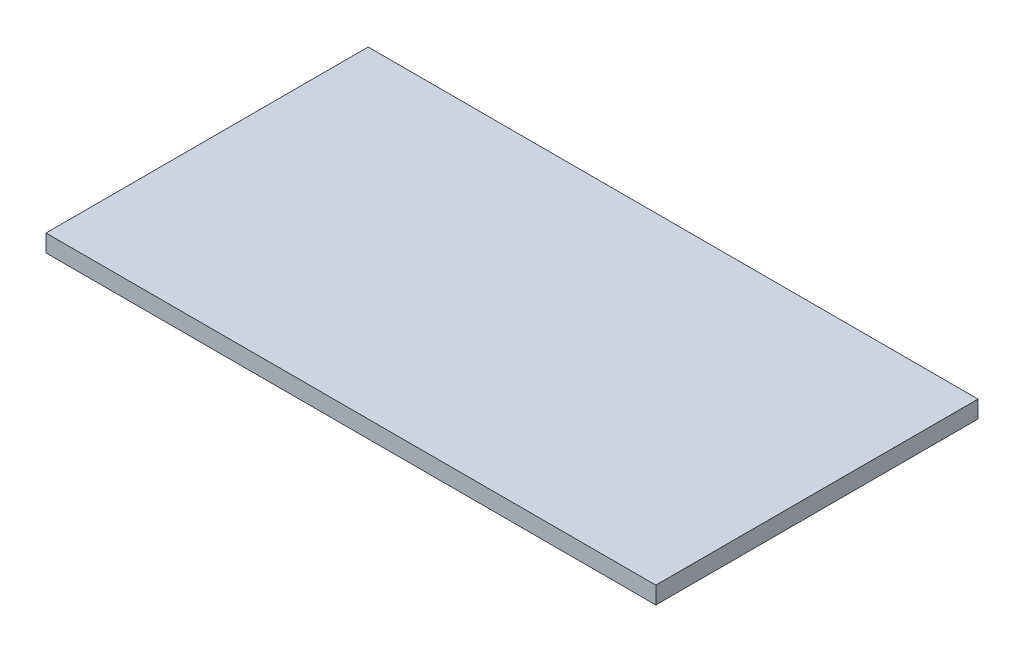
ISO-10303-21;
HEADER;
FILE_DESCRIPTION(('STEP AP214'),'2;1');
FILE_NAME('part.step','',(''),(''),'','','');
FILE_SCHEMA(('AUTOMOTIVE_DESIGN { 1 0 10303 214 1 1 1 1 }'));
ENDSEC;
DATA;
#1=APPLICATION_CONTEXT('core data for automotive mechanical design processes');
#2=APPLICATION_PROTOCOL_DEFINITION('international standard','automotive_design',2000,#1);
#3=PRODUCT_CONTEXT('',#1,'mechanical');
#4=PRODUCT('Part','Part','',(#3));
#5=PRODUCT_RELATED_PRODUCT_CATEGORY('part','',(#4));
#6=PRODUCT_DEFINITION_FORMATION('','',#4);
#7=PRODUCT_DEFINITION_CONTEXT('part definition',#1,'design');
#8=PRODUCT_DEFINITION('design','',#6,#7);
#9=PRODUCT_DEFINITION_SHAPE('','',#8);
#10=(LENGTH_UNIT() NAMED_UNIT(*) SI_UNIT(.MILLI.,.METRE.));
#11=(NAMED_UNIT(*) PLANE_ANGLE_UNIT() SI_UNIT($,.RADIAN.));
#12=(NAMED_UNIT(*) SI_UNIT($,.STERADIAN.) SOLID_ANGLE_UNIT());
#13=UNCERTAINTY_MEASURE_WITH_UNIT(LENGTH_MEASURE(1.E-05),#10,'distance_accuracy_value','');
#14=(GEOMETRIC_REPRESENTATION_CONTEXT(3) GLOBAL_UNCERTAINTY_ASSIGNED_CONTEXT((#13)) GLOBAL_UNIT_ASSIGNED_CONTEXT((#10,
#11,#12)) REPRESENTATION_CONTEXT('',''));
#15=CARTESIAN_POINT('',(0.,0.,0.));
#16=DIRECTION('',(0.,0.,1.));
#17=DIRECTION('',(1.,0.,0.));
#18=AXIS2_PLACEMENT_3D('',#15,#16,#17);
#19=CARTESIAN_POINT('',(0.,6.,0.));
#20=DIRECTION('',(1.,0.,0.));
#21=DIRECTION('',(0.,0.,-1.));
#22=AXIS2_PLACEMENT_3D('',#19,#20,#21);
#23=PLANE('',#22);
#24=DIRECTION('',(0.,0.,1.));
#25=VECTOR('',#24,1.);
#26=CARTESIAN_POINT('',(0.,0.,0.));
#27=LINE('',#26,#25);
#28=CARTESIAN_POINT('',(0.,0.,-112.));
#29=VERTEX_POINT('',#28);
#30=CARTESIAN_POINT('',(0.,0.,0.));
#31=VERTEX_POINT('',#30);
#32=EDGE_CURVE('E96',#29,#31,#27,.T.);
#33=ORIENTED_EDGE('',*,*,#32,.T.);
#34=DIRECTION('',(0.,-1.,0.));
#35=VECTOR('',#34,1.);
#36=CARTESIAN_POINT('',(0.,6.,0.));
#37=LINE('',#36,#35);
#38=CARTESIAN_POINT('',(0.,6.,0.));
#39=VERTEX_POINT('',#38);
#40=EDGE_CURVE('E11',#39,#31,#37,.T.);
#41=ORIENTED_EDGE('',*,*,#40,.F.);
#42=DIRECTION('',(0.,0.,1.));
#43=VECTOR('',#42,1.);
#44=CARTESIAN_POINT('',(0.,6.,0.));
#45=LINE('',#44,#43);
#46=CARTESIAN_POINT('',(0.,6.,-112.));
#47=VERTEX_POINT('',#46);
#48=EDGE_CURVE('E84',#47,#39,#45,.T.);
#49=ORIENTED_EDGE('',*,*,#48,.F.);
#50=DIRECTION('',(0.,-1.,0.));
#51=VECTOR('',#50,1.);
#52=CARTESIAN_POINT('',(0.,6.,-112.));
#53=LINE('',#52,#51);
#54=EDGE_CURVE('E92',#47,#29,#53,.T.);
#55=ORIENTED_EDGE('',*,*,#54,.T.);
#56=EDGE_LOOP('',(#33,#41,#49,#55));
#57=FACE_BOUND('',#56,.T.);
#58=ADVANCED_FACE('F33',(#57),#23,.F.);
#59=CARTESIAN_POINT('',(0.,6.,0.));
#60=DIRECTION('',(0.,0.,-1.));
#61=DIRECTION('',(-1.,0.,0.));
#62=AXIS2_PLACEMENT_3D('',#59,#60,#61);
#63=PLANE('',#62);
#64=DIRECTION('',(1.,0.,0.));
#65=VECTOR('',#64,1.);
#66=CARTESIAN_POINT('',(0.,0.,0.));
#67=LINE('',#66,#65);
#68=CARTESIAN_POINT('',(212.,0.,0.));
#69=VERTEX_POINT('',#68);
#70=EDGE_CURVE('E88',#31,#69,#67,.T.);
#71=ORIENTED_EDGE('',*,*,#70,.T.);
#72=DIRECTION('',(0.,-1.,0.));
#73=VECTOR('',#72,1.);
#74=CARTESIAN_POINT('',(212.,6.,0.));
#75=LINE('',#74,#73);
#76=CARTESIAN_POINT('',(212.,6.,0.));
#77=VERTEX_POINT('',#76);
#78=EDGE_CURVE('E41',#77,#69,#75,.T.);
#79=ORIENTED_EDGE('',*,*,#78,.F.);
#80=DIRECTION('',(1.,0.,0.));
#81=VECTOR('',#80,1.);
#82=CARTESIAN_POINT('',(0.,6.,0.));
#83=LINE('',#82,#81);
#84=EDGE_CURVE('E79',#39,#77,#83,.T.);
#85=ORIENTED_EDGE('',*,*,#84,.F.);
#86=ORIENTED_EDGE('',*,*,#40,.T.);
#87=EDGE_LOOP('',(#71,#79,#85,#86));
#88=FACE_BOUND('',#87,.T.);
#89=ADVANCED_FACE('F87',(#88),#63,.F.);
#90=CARTESIAN_POINT('',(212.,6.,0.));
#91=DIRECTION('',(-1.,0.,0.));
#92=DIRECTION('',(0.,0.,1.));
#93=AXIS2_PLACEMENT_3D('',#90,#91,#92);
#94=PLANE('',#93);
#95=DIRECTION('',(0.,0.,-1.));
#96=VECTOR('',#95,1.);
#97=CARTESIAN_POINT('',(212.,0.,0.));
#98=LINE('',#97,#96);
#99=CARTESIAN_POINT('',(212.,0.,-112.));
#100=VERTEX_POINT('',#99);
#101=EDGE_CURVE('E66',#69,#100,#98,.T.);
#102=ORIENTED_EDGE('',*,*,#101,.T.);
#103=DIRECTION('',(0.,-1.,0.));
#104=VECTOR('',#103,1.);
#105=CARTESIAN_POINT('',(212.,6.,-112.));
#106=LINE('',#105,#104);
#107=CARTESIAN_POINT('',(212.,6.,-112.));
#108=VERTEX_POINT('',#107);
#109=EDGE_CURVE('E89',#108,#100,#106,.T.);
#110=ORIENTED_EDGE('',*,*,#109,.F.);
#111=DIRECTION('',(0.,0.,-1.));
#112=VECTOR('',#111,1.);
#113=CARTESIAN_POINT('',(212.,6.,0.));
#114=LINE('',#113,#112);
#115=EDGE_CURVE('E82',#77,#108,#114,.T.);
#116=ORIENTED_EDGE('',*,*,#115,.F.);
#117=ORIENTED_EDGE('',*,*,#78,.T.);
#118=EDGE_LOOP('',(#102,#110,#116,#117));
#119=FACE_BOUND('',#118,.T.);
#120=ADVANCED_FACE('F90',(#119),#94,.F.);
#121=CARTESIAN_POINT('',(0.,6.,-112.));
#122=DIRECTION('',(0.,0.,1.));
#123=DIRECTION('',(1.,0.,0.));
#124=AXIS2_PLACEMENT_3D('',#121,#122,#123);
#125=PLANE('',#124);
#126=DIRECTION('',(-1.,0.,0.));
#127=VECTOR('',#126,1.);
#128=CARTESIAN_POINT('',(0.,0.,-112.));
#129=LINE('',#128,#127);
#130=EDGE_CURVE('E72',#100,#29,#129,.T.);
#131=ORIENTED_EDGE('',*,*,#130,.T.);
#132=ORIENTED_EDGE('',*,*,#54,.F.);
#133=DIRECTION('',(-1.,0.,0.));
#134=VECTOR('',#133,1.);
#135=CARTESIAN_POINT('',(0.,6.,-112.));
#136=LINE('',#135,#134);
#137=EDGE_CURVE('E49',#108,#47,#136,.T.);
#138=ORIENTED_EDGE('',*,*,#137,.F.);
#139=ORIENTED_EDGE('',*,*,#109,.T.);
#140=EDGE_LOOP('',(#131,#132,#138,#139));
#141=FACE_BOUND('',#140,.T.);
#142=ADVANCED_FACE('F103',(#141),#125,.F.);
#143=CARTESIAN_POINT('',(0.,6.,0.));
#144=DIRECTION('',(0.,-1.,0.));
#145=DIRECTION('',(0.,0.,-1.));
#146=AXIS2_PLACEMENT_3D('',#143,#144,#145);
#147=PLANE('',#146);
#148=ORIENTED_EDGE('',*,*,#48,.T.);
#149=ORIENTED_EDGE('',*,*,#84,.T.);
#150=ORIENTED_EDGE('',*,*,#115,.T.);
#151=ORIENTED_EDGE('',*,*,#137,.T.);
#152=EDGE_LOOP('',(#148,#149,#150,#151));
#153=FACE_BOUND('',#152,.T.);
#154=ADVANCED_FACE('F80',(#153),#147,.F.);
#155=CARTESIAN_POINT('',(0.,0.,0.));
#156=DIRECTION('',(0.,-1.,0.));
#157=DIRECTION('',(0.,0.,-1.));
#158=AXIS2_PLACEMENT_3D('',#155,#156,#157);
#159=PLANE('',#158);
#160=ORIENTED_EDGE('',*,*,#32,.F.);
#161=ORIENTED_EDGE('',*,*,#130,.F.);
#162=ORIENTED_EDGE('',*,*,#101,.F.);
#163=ORIENTED_EDGE('',*,*,#70,.F.);
#164=EDGE_LOOP('',(#160,#161,#162,#163));
#165=FACE_BOUND('',#164,.T.);
#166=ADVANCED_FACE('F106',(#165),#159,.T.);
#167=CLOSED_SHELL('',(#58,#89,#120,#142,#154,#166));
#168=MANIFOLD_SOLID_BREP('B2',#167);
#169=ADVANCED_BREP_SHAPE_REPRESENTATION('',(#18,#168),#14);
#170=SHAPE_DEFINITION_REPRESENTATION(#9,#169);
ENDSEC;
END-ISO-10303-21;
